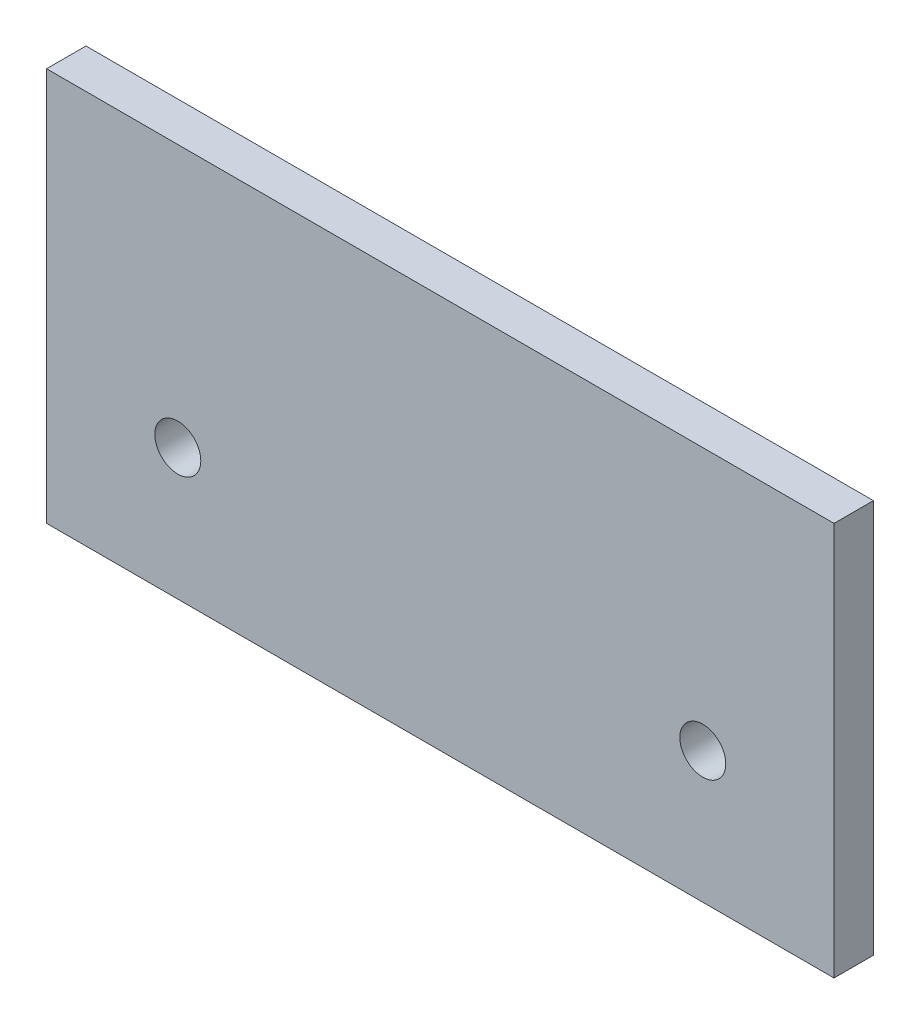
ISO-10303-21;
HEADER;
FILE_DESCRIPTION(('STEP AP214'),'2;1');
FILE_NAME('part.step','',(''),(''),'','','');
FILE_SCHEMA(('AUTOMOTIVE_DESIGN { 1 0 10303 214 1 1 1 1 }'));
ENDSEC;
DATA;
#1=APPLICATION_CONTEXT('core data for automotive mechanical design processes');
#2=APPLICATION_PROTOCOL_DEFINITION('international standard','automotive_design',2000,#1);
#3=PRODUCT_CONTEXT('',#1,'mechanical');
#4=PRODUCT('Part','Part','',(#3));
#5=PRODUCT_RELATED_PRODUCT_CATEGORY('part','',(#4));
#6=PRODUCT_DEFINITION_FORMATION('','',#4);
#7=PRODUCT_DEFINITION_CONTEXT('part definition',#1,'design');
#8=PRODUCT_DEFINITION('design','',#6,#7);
#9=PRODUCT_DEFINITION_SHAPE('','',#8);
#10=(LENGTH_UNIT() NAMED_UNIT(*) SI_UNIT(.MILLI.,.METRE.));
#11=(NAMED_UNIT(*) PLANE_ANGLE_UNIT() SI_UNIT($,.RADIAN.));
#12=(NAMED_UNIT(*) SI_UNIT($,.STERADIAN.) SOLID_ANGLE_UNIT());
#13=UNCERTAINTY_MEASURE_WITH_UNIT(LENGTH_MEASURE(1.E-05),#10,'distance_accuracy_value','');
#14=(GEOMETRIC_REPRESENTATION_CONTEXT(3) GLOBAL_UNCERTAINTY_ASSIGNED_CONTEXT((#13)) GLOBAL_UNIT_ASSIGNED_CONTEXT((#10,
#11,#12)) REPRESENTATION_CONTEXT('',''));
#15=CARTESIAN_POINT('',(0.,0.,0.));
#16=DIRECTION('',(0.,0.,1.));
#17=DIRECTION('',(1.,0.,0.));
#18=AXIS2_PLACEMENT_3D('',#15,#16,#17);
#19=CARTESIAN_POINT('',(-50.,20.,3.));
#20=DIRECTION('',(1.,0.,0.));
#21=DIRECTION('',(0.,1.,0.));
#22=AXIS2_PLACEMENT_3D('',#19,#20,#21);
#23=PLANE('',#22);
#24=DIRECTION('',(0.,-1.,0.));
#25=VECTOR('',#24,1.);
#26=CARTESIAN_POINT('',(-50.,20.,0.));
#27=LINE('',#26,#25);
#28=CARTESIAN_POINT('',(-50.,20.,0.));
#29=VERTEX_POINT('',#28);
#30=CARTESIAN_POINT('',(-50.,-10.,0.));
#31=VERTEX_POINT('',#30);
#32=EDGE_CURVE('E94',#29,#31,#27,.T.);
#33=ORIENTED_EDGE('',*,*,#32,.T.);
#34=DIRECTION('',(0.,0.,-1.));
#35=VECTOR('',#34,1.);
#36=CARTESIAN_POINT('',(-50.,-10.,3.));
#37=LINE('',#36,#35);
#38=CARTESIAN_POINT('',(-50.,-10.,3.));
#39=VERTEX_POINT('',#38);
#40=EDGE_CURVE('E11',#39,#31,#37,.T.);
#41=ORIENTED_EDGE('',*,*,#40,.F.);
#42=DIRECTION('',(0.,-1.,0.));
#43=VECTOR('',#42,1.);
#44=CARTESIAN_POINT('',(-50.,20.,3.));
#45=LINE('',#44,#43);
#46=CARTESIAN_POINT('',(-50.,20.,3.));
#47=VERTEX_POINT('',#46);
#48=EDGE_CURVE('E82',#47,#39,#45,.T.);
#49=ORIENTED_EDGE('',*,*,#48,.F.);
#50=DIRECTION('',(0.,0.,-1.));
#51=VECTOR('',#50,1.);
#52=CARTESIAN_POINT('',(-50.,20.,3.));
#53=LINE('',#52,#51);
#54=EDGE_CURVE('E90',#47,#29,#53,.T.);
#55=ORIENTED_EDGE('',*,*,#54,.T.);
#56=EDGE_LOOP('',(#33,#41,#49,#55));
#57=FACE_BOUND('',#56,.T.);
#58=ADVANCED_FACE('F31',(#57),#23,.F.);
#59=CARTESIAN_POINT('',(-50.,-10.,3.));
#60=DIRECTION('',(0.,1.,0.));
#61=DIRECTION('',(-1.,0.,0.));
#62=AXIS2_PLACEMENT_3D('',#59,#60,#61);
#63=PLANE('',#62);
#64=DIRECTION('',(1.,0.,0.));
#65=VECTOR('',#64,1.);
#66=CARTESIAN_POINT('',(-50.,-10.,0.));
#67=LINE('',#66,#65);
#68=CARTESIAN_POINT('',(10.,-10.,0.));
#69=VERTEX_POINT('',#68);
#70=EDGE_CURVE('E86',#31,#69,#67,.T.);
#71=ORIENTED_EDGE('',*,*,#70,.T.);
#72=DIRECTION('',(0.,0.,-1.));
#73=VECTOR('',#72,1.);
#74=CARTESIAN_POINT('',(10.,-10.,3.));
#75=LINE('',#74,#73);
#76=CARTESIAN_POINT('',(10.,-10.,3.));
#77=VERTEX_POINT('',#76);
#78=EDGE_CURVE('E39',#77,#69,#75,.T.);
#79=ORIENTED_EDGE('',*,*,#78,.F.);
#80=DIRECTION('',(1.,0.,0.));
#81=VECTOR('',#80,1.);
#82=CARTESIAN_POINT('',(-50.,-10.,3.));
#83=LINE('',#82,#81);
#84=EDGE_CURVE('E77',#39,#77,#83,.T.);
#85=ORIENTED_EDGE('',*,*,#84,.F.);
#86=ORIENTED_EDGE('',*,*,#40,.T.);
#87=EDGE_LOOP('',(#71,#79,#85,#86));
#88=FACE_BOUND('',#87,.T.);
#89=ADVANCED_FACE('F85',(#88),#63,.F.);
#90=CARTESIAN_POINT('',(9.99999999999999,20.,3.));
#91=DIRECTION('',(-1.,0.,0.));
#92=DIRECTION('',(0.,-1.,0.));
#93=AXIS2_PLACEMENT_3D('',#90,#91,#92);
#94=PLANE('',#93);
#95=DIRECTION('',(0.,1.,0.));
#96=VECTOR('',#95,1.);
#97=CARTESIAN_POINT('',(9.99999999999999,20.,0.));
#98=LINE('',#97,#96);
#99=CARTESIAN_POINT('',(9.99999999999999,20.,0.));
#100=VERTEX_POINT('',#99);
#101=EDGE_CURVE('E64',#69,#100,#98,.T.);
#102=ORIENTED_EDGE('',*,*,#101,.T.);
#103=DIRECTION('',(0.,0.,-1.));
#104=VECTOR('',#103,1.);
#105=CARTESIAN_POINT('',(9.99999999999999,20.,3.));
#106=LINE('',#105,#104);
#107=CARTESIAN_POINT('',(9.99999999999999,20.,3.));
#108=VERTEX_POINT('',#107);
#109=EDGE_CURVE('E87',#108,#100,#106,.T.);
#110=ORIENTED_EDGE('',*,*,#109,.F.);
#111=DIRECTION('',(0.,1.,0.));
#112=VECTOR('',#111,1.);
#113=CARTESIAN_POINT('',(9.99999999999999,20.,3.));
#114=LINE('',#113,#112);
#115=EDGE_CURVE('E80',#77,#108,#114,.T.);
#116=ORIENTED_EDGE('',*,*,#115,.F.);
#117=ORIENTED_EDGE('',*,*,#78,.T.);
#118=EDGE_LOOP('',(#102,#110,#116,#117));
#119=FACE_BOUND('',#118,.T.);
#120=ADVANCED_FACE('F88',(#119),#94,.F.);
#121=CARTESIAN_POINT('',(-50.,20.,3.));
#122=DIRECTION('',(0.,-1.,0.));
#123=DIRECTION('',(0.,0.,-1.));
#124=AXIS2_PLACEMENT_3D('',#121,#122,#123);
#125=PLANE('',#124);
#126=DIRECTION('',(-1.,0.,0.));
#127=VECTOR('',#126,1.);
#128=CARTESIAN_POINT('',(-50.,20.,0.));
#129=LINE('',#128,#127);
#130=EDGE_CURVE('E70',#100,#29,#129,.T.);
#131=ORIENTED_EDGE('',*,*,#130,.T.);
#132=ORIENTED_EDGE('',*,*,#54,.F.);
#133=DIRECTION('',(-1.,0.,0.));
#134=VECTOR('',#133,1.);
#135=CARTESIAN_POINT('',(-50.,20.,3.));
#136=LINE('',#135,#134);
#137=EDGE_CURVE('E47',#108,#47,#136,.T.);
#138=ORIENTED_EDGE('',*,*,#137,.F.);
#139=ORIENTED_EDGE('',*,*,#109,.T.);
#140=EDGE_LOOP('',(#131,#132,#138,#139));
#141=FACE_BOUND('',#140,.T.);
#142=ADVANCED_FACE('F102',(#141),#125,.F.);
#143=CARTESIAN_POINT('',(-50.,-10.,3.));
#144=DIRECTION('',(0.,0.,1.));
#145=DIRECTION('',(1.,0.,0.));
#146=AXIS2_PLACEMENT_3D('',#143,#144,#145);
#147=PLANE('',#146);
#148=CARTESIAN_POINT('',(0.,0.,3.));
#149=DIRECTION('',(0.,0.,1.));
#150=DIRECTION('',(1.,0.,0.));
#151=AXIS2_PLACEMENT_3D('',#148,#149,#150);
#152=CIRCLE('',#151,1.75);
#153=CARTESIAN_POINT('',(1.75,0.,3.));
#154=VERTEX_POINT('',#153);
#155=EDGE_CURVE('E114',#154,#154,#152,.T.);
#156=ORIENTED_EDGE('',*,*,#155,.F.);
#157=EDGE_LOOP('',(#156));
#158=FACE_BOUND('',#157,.T.);
#159=CARTESIAN_POINT('',(-40.,0.,3.));
#160=DIRECTION('',(0.,0.,1.));
#161=DIRECTION('',(1.,0.,0.));
#162=AXIS2_PLACEMENT_3D('',#159,#160,#161);
#163=CIRCLE('',#162,1.75);
#164=CARTESIAN_POINT('',(-38.25,0.,3.));
#165=VERTEX_POINT('',#164);
#166=EDGE_CURVE('E108',#165,#165,#163,.T.);
#167=ORIENTED_EDGE('',*,*,#166,.F.);
#168=EDGE_LOOP('',(#167));
#169=FACE_BOUND('',#168,.T.);
#170=ORIENTED_EDGE('',*,*,#48,.T.);
#171=ORIENTED_EDGE('',*,*,#84,.T.);
#172=ORIENTED_EDGE('',*,*,#115,.T.);
#173=ORIENTED_EDGE('',*,*,#137,.T.);
#174=EDGE_LOOP('',(#170,#171,#172,#173));
#175=FACE_BOUND('',#174,.T.);
#176=ADVANCED_FACE('F78',(#158,#169,#175),#147,.T.);
#177=CARTESIAN_POINT('',(-50.,-10.,0.));
#178=DIRECTION('',(0.,0.,1.));
#179=DIRECTION('',(1.,0.,0.));
#180=AXIS2_PLACEMENT_3D('',#177,#178,#179);
#181=PLANE('',#180);
#182=CARTESIAN_POINT('',(0.,0.,0.));
#183=DIRECTION('',(0.,0.,1.));
#184=DIRECTION('',(1.,0.,0.));
#185=AXIS2_PLACEMENT_3D('',#182,#183,#184);
#186=CIRCLE('',#185,1.75);
#187=CARTESIAN_POINT('',(1.75,0.,0.));
#188=VERTEX_POINT('',#187);
#189=EDGE_CURVE('E111',#188,#188,#186,.T.);
#190=ORIENTED_EDGE('',*,*,#189,.T.);
#191=EDGE_LOOP('',(#190));
#192=FACE_BOUND('',#191,.T.);
#193=CARTESIAN_POINT('',(-40.,0.,0.));
#194=DIRECTION('',(0.,0.,1.));
#195=DIRECTION('',(1.,0.,0.));
#196=AXIS2_PLACEMENT_3D('',#193,#194,#195);
#197=CIRCLE('',#196,1.75);
#198=CARTESIAN_POINT('',(-38.25,0.,0.));
#199=VERTEX_POINT('',#198);
#200=EDGE_CURVE('E97',#199,#199,#197,.T.);
#201=ORIENTED_EDGE('',*,*,#200,.T.);
#202=EDGE_LOOP('',(#201));
#203=FACE_BOUND('',#202,.T.);
#204=ORIENTED_EDGE('',*,*,#32,.F.);
#205=ORIENTED_EDGE('',*,*,#130,.F.);
#206=ORIENTED_EDGE('',*,*,#101,.F.);
#207=ORIENTED_EDGE('',*,*,#70,.F.);
#208=EDGE_LOOP('',(#204,#205,#206,#207));
#209=FACE_BOUND('',#208,.T.);
#210=ADVANCED_FACE('F105',(#192,#203,#209),#181,.F.);
#211=CARTESIAN_POINT('',(-40.,0.,0.));
#212=DIRECTION('',(0.,0.,1.));
#213=DIRECTION('',(1.,0.,0.));
#214=AXIS2_PLACEMENT_3D('',#211,#212,#213);
#215=CYLINDRICAL_SURFACE('',#214,1.75);
#216=ORIENTED_EDGE('',*,*,#200,.F.);
#217=EDGE_LOOP('',(#216));
#218=FACE_BOUND('',#217,.T.);
#219=ORIENTED_EDGE('',*,*,#166,.T.);
#220=EDGE_LOOP('',(#219));
#221=FACE_BOUND('',#220,.T.);
#222=ADVANCED_FACE('F125',(#218,#221),#215,.F.);
#223=CARTESIAN_POINT('',(0.,0.,0.));
#224=DIRECTION('',(0.,0.,1.));
#225=DIRECTION('',(1.,0.,0.));
#226=AXIS2_PLACEMENT_3D('',#223,#224,#225);
#227=CYLINDRICAL_SURFACE('',#226,1.75);
#228=ORIENTED_EDGE('',*,*,#189,.F.);
#229=EDGE_LOOP('',(#228));
#230=FACE_BOUND('',#229,.T.);
#231=ORIENTED_EDGE('',*,*,#155,.T.);
#232=EDGE_LOOP('',(#231));
#233=FACE_BOUND('',#232,.T.);
#234=ADVANCED_FACE('F122',(#230,#233),#227,.F.);
#235=CLOSED_SHELL('',(#58,#89,#120,#142,#176,#210,#222,#234));
#236=MANIFOLD_SOLID_BREP('B2',#235);
#237=ADVANCED_BREP_SHAPE_REPRESENTATION('',(#18,#236),#14);
#238=SHAPE_DEFINITION_REPRESENTATION(#9,#237);
ENDSEC;
END-ISO-10303-21;
